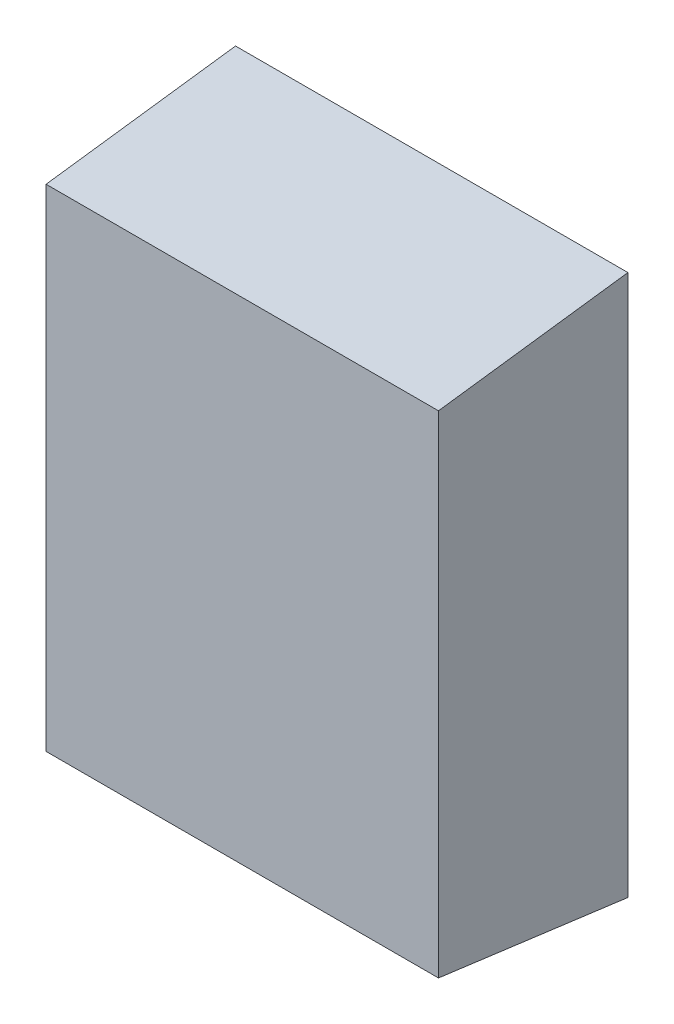
ISO-10303-21;
HEADER;
FILE_DESCRIPTION(('STEP AP214'),'2;1');
FILE_NAME('part.step','',(''),(''),'','','');
FILE_SCHEMA(('AUTOMOTIVE_DESIGN { 1 0 10303 214 1 1 1 1 }'));
ENDSEC;
DATA;
#1=APPLICATION_CONTEXT('core data for automotive mechanical design processes');
#2=APPLICATION_PROTOCOL_DEFINITION('international standard','automotive_design',2000,#1);
#3=PRODUCT_CONTEXT('',#1,'mechanical');
#4=PRODUCT('Part','Part','',(#3));
#5=PRODUCT_RELATED_PRODUCT_CATEGORY('part','',(#4));
#6=PRODUCT_DEFINITION_FORMATION('','',#4);
#7=PRODUCT_DEFINITION_CONTEXT('part definition',#1,'design');
#8=PRODUCT_DEFINITION('design','',#6,#7);
#9=PRODUCT_DEFINITION_SHAPE('','',#8);
#10=(LENGTH_UNIT() NAMED_UNIT(*) SI_UNIT(.MILLI.,.METRE.));
#11=(NAMED_UNIT(*) PLANE_ANGLE_UNIT() SI_UNIT($,.RADIAN.));
#12=(NAMED_UNIT(*) SI_UNIT($,.STERADIAN.) SOLID_ANGLE_UNIT());
#13=UNCERTAINTY_MEASURE_WITH_UNIT(LENGTH_MEASURE(1.E-05),#10,'distance_accuracy_value','');
#14=(GEOMETRIC_REPRESENTATION_CONTEXT(3) GLOBAL_UNCERTAINTY_ASSIGNED_CONTEXT((#13)) GLOBAL_UNIT_ASSIGNED_CONTEXT((#10,
#11,#12)) REPRESENTATION_CONTEXT('',''));
#15=CARTESIAN_POINT('',(0.,0.,0.));
#16=DIRECTION('',(0.,0.,1.));
#17=DIRECTION('',(1.,0.,0.));
#18=AXIS2_PLACEMENT_3D('',#15,#16,#17);
#19=CARTESIAN_POINT('',(-0.00667937524977396,-0.771801987569789,0.412208026250708));
#20=DIRECTION('',(0.,0.,1.));
#21=DIRECTION('',(1.,0.,0.));
#22=AXIS2_PLACEMENT_3D('',#19,#20,#21);
#23=PLANE('',#22);
#24=DIRECTION('',(0.,1.,0.));
#25=VECTOR('',#24,1.);
#26=CARTESIAN_POINT('',(0.446445624750304,-0.771801987569789,0.412208026250708));
#27=LINE('',#26,#25);
#28=CARTESIAN_POINT('',(0.446445624750304,-1.39680198756973,0.412208026250702));
#29=VERTEX_POINT('',#28);
#30=CARTESIAN_POINT('',(0.44644562475021,-0.146801987569707,0.412208026250708));
#31=VERTEX_POINT('',#30);
#32=EDGE_CURVE('E11',#29,#31,#27,.T.);
#33=ORIENTED_EDGE('',*,*,#32,.F.);
#34=DIRECTION('',(1.,0.,0.));
#35=VECTOR('',#34,1.);
#36=CARTESIAN_POINT('',(-0.00667937524977396,-1.3968019875698,0.412208026250708));
#37=LINE('',#36,#35);
#38=CARTESIAN_POINT('',(-0.459804375249758,-1.3968019875698,0.412208026250708));
#39=VERTEX_POINT('',#38);
#40=EDGE_CURVE('E23',#39,#29,#37,.T.);
#41=ORIENTED_EDGE('',*,*,#40,.F.);
#42=DIRECTION('',(0.,-1.,0.));
#43=VECTOR('',#42,1.);
#44=CARTESIAN_POINT('',(-0.459804375249852,-0.771801987569789,0.412208026250708));
#45=LINE('',#44,#43);
#46=CARTESIAN_POINT('',(-0.459804375249852,-0.146801987569775,0.412208026250705));
#47=VERTEX_POINT('',#46);
#48=EDGE_CURVE('E60',#47,#39,#45,.T.);
#49=ORIENTED_EDGE('',*,*,#48,.F.);
#50=DIRECTION('',(-1.,0.,0.));
#51=VECTOR('',#50,1.);
#52=CARTESIAN_POINT('',(-0.00667937524977396,-0.146801987569707,0.412208026250708));
#53=LINE('',#52,#51);
#54=EDGE_CURVE('E85',#31,#47,#53,.T.);
#55=ORIENTED_EDGE('',*,*,#54,.F.);
#56=EDGE_LOOP('',(#33,#41,#49,#55));
#57=FACE_BOUND('',#56,.T.);
#58=ADVANCED_FACE('F16',(#57),#23,.F.);
#59=CARTESIAN_POINT('',(0.219883124750137,-0.175677122974484,0.630958026250712));
#60=DIRECTION('',(-1.00326550189351E-13,0.991400140533472,0.130865432220325));
#61=DIRECTION('',(0.,-0.130865432220325,0.991400140533472));
#62=AXIS2_PLACEMENT_3D('',#59,#60,#61);
#63=PLANE('',#62);
#64=DIRECTION('',(0.,-0.130865432220325,0.991400140533472));
#65=VECTOR('',#64,1.);
#66=CARTESIAN_POINT('',(-0.459804375249852,-0.175677122974551,0.630958026250703));
#67=LINE('',#66,#65);
#68=CARTESIAN_POINT('',(-0.459804375249847,-0.204552258379283,0.849708026250708));
#69=VERTEX_POINT('',#68);
#70=EDGE_CURVE('E83',#47,#69,#67,.T.);
#71=ORIENTED_EDGE('',*,*,#70,.T.);
#72=DIRECTION('',(1.,0.,0.));
#73=VECTOR('',#72,1.);
#74=CARTESIAN_POINT('',(0.219883124750137,-0.204552258379238,0.849708026250717));
#75=LINE('',#74,#73);
#76=CARTESIAN_POINT('',(0.446445624750212,-0.204552258379215,0.849708026250711));
#77=VERTEX_POINT('',#76);
#78=EDGE_CURVE('E73',#69,#77,#75,.T.);
#79=ORIENTED_EDGE('',*,*,#78,.T.);
#80=DIRECTION('',(0.,0.130865432220325,-0.991400140533472));
#81=VECTOR('',#80,1.);
#82=CARTESIAN_POINT('',(0.446445624750183,-0.175677122974461,0.630958026250714));
#83=LINE('',#82,#81);
#84=EDGE_CURVE('E79',#77,#31,#83,.T.);
#85=ORIENTED_EDGE('',*,*,#84,.T.);
#86=ORIENTED_EDGE('',*,*,#54,.T.);
#87=EDGE_LOOP('',(#71,#79,#85,#86));
#88=FACE_BOUND('',#87,.T.);
#89=ADVANCED_FACE('F90',(#88),#63,.T.);
#90=CARTESIAN_POINT('',(0.446445624750304,-1.39680198756971,0.412208026250708));
#91=DIRECTION('',(1.,1.01196828694583E-13,0.));
#92=DIRECTION('',(-1.01196828694583E-13,1.,0.));
#93=AXIS2_PLACEMENT_3D('',#90,#91,#92);
#94=PLANE('',#93);
#95=ORIENTED_EDGE('',*,*,#32,.T.);
#96=ORIENTED_EDGE('',*,*,#84,.F.);
#97=DIRECTION('',(1.01196828694583E-13,-1.,0.));
#98=VECTOR('',#97,1.);
#99=CARTESIAN_POINT('',(0.446445624750304,-1.39680198756971,0.849708026250708));
#100=LINE('',#99,#98);
#101=CARTESIAN_POINT('',(0.446445624750299,-1.33905171676025,0.849708026250708));
#102=VERTEX_POINT('',#101);
#103=EDGE_CURVE('E77',#77,#102,#100,.T.);
#104=ORIENTED_EDGE('',*,*,#103,.T.);
#105=DIRECTION('',(0.,-0.130865432220324,-0.991400140533472));
#106=VECTOR('',#105,1.);
#107=CARTESIAN_POINT('',(0.446445624750298,-1.3390517167602,0.849708026250708));
#108=LINE('',#107,#106);
#109=EDGE_CURVE('E62',#102,#29,#108,.T.);
#110=ORIENTED_EDGE('',*,*,#109,.T.);
#111=EDGE_LOOP('',(#95,#96,#104,#110));
#112=FACE_BOUND('',#111,.T.);
#113=ADVANCED_FACE('F88',(#112),#94,.T.);
#114=CARTESIAN_POINT('',(0.219883124750258,-1.36792685216498,0.630958026250712));
#115=DIRECTION('',(1.00326550189351E-13,-0.991400140533472,0.130865432220325));
#116=DIRECTION('',(0.,-0.130865432220325,-0.991400140533472));
#117=AXIS2_PLACEMENT_3D('',#114,#115,#116);
#118=PLANE('',#117);
#119=DIRECTION('',(0.,-0.130865432220325,-0.991400140533472));
#120=VECTOR('',#119,1.);
#121=CARTESIAN_POINT('',(-0.459804375249731,-1.36792685216505,0.63095802625072));
#122=LINE('',#121,#120);
#123=CARTESIAN_POINT('',(-0.459804375249788,-1.33905171676029,0.849708026250711));
#124=VERTEX_POINT('',#123);
#125=EDGE_CURVE('E54',#124,#39,#122,.T.);
#126=ORIENTED_EDGE('',*,*,#125,.T.);
#127=ORIENTED_EDGE('',*,*,#40,.T.);
#128=ORIENTED_EDGE('',*,*,#109,.F.);
#129=DIRECTION('',(-1.,0.,0.));
#130=VECTOR('',#129,1.);
#131=CARTESIAN_POINT('',(0.219883124750258,-1.33905171676022,0.849708026250711));
#132=LINE('',#131,#130);
#133=EDGE_CURVE('E63',#102,#124,#132,.T.);
#134=ORIENTED_EDGE('',*,*,#133,.T.);
#135=EDGE_LOOP('',(#126,#127,#128,#134));
#136=FACE_BOUND('',#135,.T.);
#137=ADVANCED_FACE('F67',(#136),#118,.T.);
#138=CARTESIAN_POINT('',(-0.459804375249852,-0.146801987569799,0.412208026250708));
#139=DIRECTION('',(-1.,-1.01196828694583E-13,0.));
#140=DIRECTION('',(1.01196828694583E-13,-1.,0.));
#141=AXIS2_PLACEMENT_3D('',#138,#139,#140);
#142=PLANE('',#141);
#143=DIRECTION('',(-1.01196828694583E-13,1.,0.));
#144=VECTOR('',#143,1.);
#145=CARTESIAN_POINT('',(-0.459804375249852,-0.146801987569799,0.849708026250708));
#146=LINE('',#145,#144);
#147=EDGE_CURVE('E59',#124,#69,#146,.T.);
#148=ORIENTED_EDGE('',*,*,#147,.T.);
#149=ORIENTED_EDGE('',*,*,#70,.F.);
#150=ORIENTED_EDGE('',*,*,#48,.T.);
#151=ORIENTED_EDGE('',*,*,#125,.F.);
#152=EDGE_LOOP('',(#148,#149,#150,#151));
#153=FACE_BOUND('',#152,.T.);
#154=ADVANCED_FACE('F56',(#153),#142,.T.);
#155=CARTESIAN_POINT('',(-0.00667937524977396,-0.771801987569789,0.849708026250708));
#156=DIRECTION('',(0.,0.,1.));
#157=DIRECTION('',(1.,0.,0.));
#158=AXIS2_PLACEMENT_3D('',#155,#156,#157);
#159=PLANE('',#158);
#160=ORIENTED_EDGE('',*,*,#103,.F.);
#161=ORIENTED_EDGE('',*,*,#78,.F.);
#162=ORIENTED_EDGE('',*,*,#147,.F.);
#163=ORIENTED_EDGE('',*,*,#133,.F.);
#164=EDGE_LOOP('',(#160,#161,#162,#163));
#165=FACE_BOUND('',#164,.T.);
#166=ADVANCED_FACE('F72',(#165),#159,.T.);
#167=CLOSED_SHELL('',(#58,#89,#113,#137,#154,#166));
#168=MANIFOLD_SOLID_BREP('B1',#167);
#169=ADVANCED_BREP_SHAPE_REPRESENTATION('',(#18,#168),#14);
#170=SHAPE_DEFINITION_REPRESENTATION(#9,#169);
ENDSEC;
END-ISO-10303-21;
